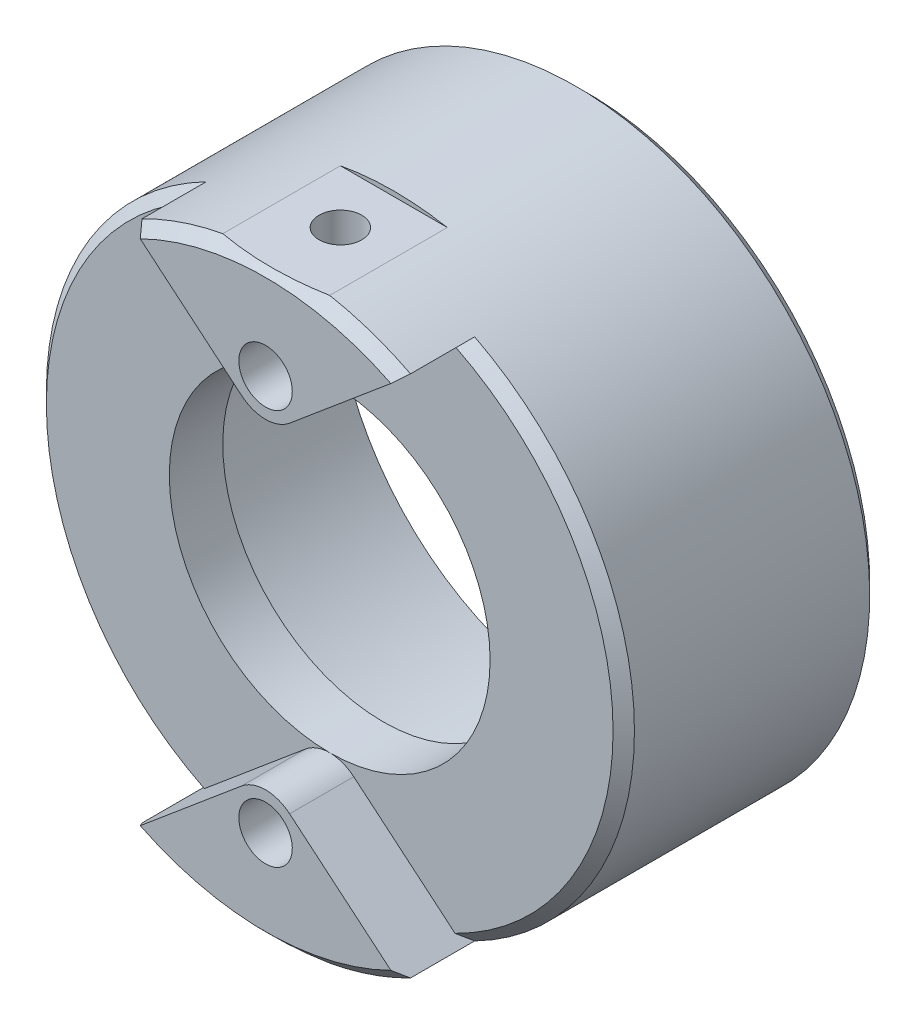
ISO-10303-21;
HEADER;
FILE_DESCRIPTION(('STEP AP214'),'2;1');
FILE_NAME('part.step','',(''),(''),'','','');
FILE_SCHEMA(('AUTOMOTIVE_DESIGN { 1 0 10303 214 1 1 1 1 }'));
ENDSEC;
DATA;
#1=APPLICATION_CONTEXT('core data for automotive mechanical design processes');
#2=APPLICATION_PROTOCOL_DEFINITION('international standard','automotive_design',2000,#1);
#3=PRODUCT_CONTEXT('',#1,'mechanical');
#4=PRODUCT('Part','Part','',(#3));
#5=PRODUCT_RELATED_PRODUCT_CATEGORY('part','',(#4));
#6=PRODUCT_DEFINITION_FORMATION('','',#4);
#7=PRODUCT_DEFINITION_CONTEXT('part definition',#1,'design');
#8=PRODUCT_DEFINITION('design','',#6,#7);
#9=PRODUCT_DEFINITION_SHAPE('','',#8);
#10=(LENGTH_UNIT() NAMED_UNIT(*) SI_UNIT(.MILLI.,.METRE.));
#11=(NAMED_UNIT(*) PLANE_ANGLE_UNIT() SI_UNIT($,.RADIAN.));
#12=(NAMED_UNIT(*) SI_UNIT($,.STERADIAN.) SOLID_ANGLE_UNIT());
#13=UNCERTAINTY_MEASURE_WITH_UNIT(LENGTH_MEASURE(1.E-05),#10,'distance_accuracy_value','');
#14=(GEOMETRIC_REPRESENTATION_CONTEXT(3) GLOBAL_UNCERTAINTY_ASSIGNED_CONTEXT((#13)) GLOBAL_UNIT_ASSIGNED_CONTEXT((#10,
#11,#12)) REPRESENTATION_CONTEXT('',''));
#15=CARTESIAN_POINT('',(0.,0.,0.));
#16=DIRECTION('',(0.,0.,1.));
#17=DIRECTION('',(1.,0.,0.));
#18=AXIS2_PLACEMENT_3D('',#15,#16,#17);
#19=CARTESIAN_POINT('',(0.,15.,19.));
#20=DIRECTION('',(0.,0.,1.));
#21=DIRECTION('',(0.,-1.,0.));
#22=AXIS2_PLACEMENT_3D('',#19,#20,#21);
#23=PLANE('',#22);
#24=CARTESIAN_POINT('',(0.,0.,19.));
#25=DIRECTION('',(0.,0.,1.));
#26=DIRECTION('',(0.,-1.,0.));
#27=AXIS2_PLACEMENT_3D('',#24,#25,#26);
#28=CIRCLE('',#27,15.);
#29=CARTESIAN_POINT('',(0.,-15.,19.));
#30=VERTEX_POINT('',#29);
#31=EDGE_CURVE('E302',#30,#30,#28,.T.);
#32=ORIENTED_EDGE('',*,*,#31,.T.);
#33=EDGE_LOOP('',(#32));
#34=FACE_BOUND('',#33,.T.);
#35=CARTESIAN_POINT('',(0.,0.,19.));
#36=DIRECTION('',(0.,0.,1.));
#37=DIRECTION('',(0.,-1.,0.));
#38=AXIS2_PLACEMENT_3D('',#35,#36,#37);
#39=CIRCLE('',#38,23.5);
#40=CARTESIAN_POINT('',(0.,-23.5,19.));
#41=VERTEX_POINT('',#40);
#42=EDGE_CURVE('E303',#41,#41,#39,.T.);
#43=ORIENTED_EDGE('',*,*,#42,.F.);
#44=EDGE_LOOP('',(#43));
#45=FACE_BOUND('',#44,.T.);
#46=CARTESIAN_POINT('',(0.,18.5,19.));
#47=DIRECTION('',(0.,0.,1.));
#48=DIRECTION('',(0.,-1.,0.));
#49=AXIS2_PLACEMENT_3D('',#46,#47,#48);
#50=CIRCLE('',#49,2.5);
#51=CARTESIAN_POINT('',(0.,16.,19.));
#52=VERTEX_POINT('',#51);
#53=EDGE_CURVE('E226',#52,#52,#50,.F.);
#54=ORIENTED_EDGE('',*,*,#53,.F.);
#55=EDGE_LOOP('',(#54));
#56=FACE_BOUND('',#55,.T.);
#57=CARTESIAN_POINT('',(0.,-18.5,19.));
#58=DIRECTION('',(0.,0.,1.));
#59=DIRECTION('',(0.,-1.,0.));
#60=AXIS2_PLACEMENT_3D('',#57,#58,#59);
#61=CIRCLE('',#60,2.5);
#62=CARTESIAN_POINT('',(0.,-21.,19.));
#63=VERTEX_POINT('',#62);
#64=EDGE_CURVE('E249',#63,#63,#61,.T.);
#65=ORIENTED_EDGE('',*,*,#64,.T.);
#66=EDGE_LOOP('',(#65));
#67=FACE_BOUND('',#66,.T.);
#68=ADVANCED_FACE('F78',(#34,#45,#56,#67),#23,.F.);
#69=CARTESIAN_POINT('',(0.,27.5,30.));
#70=DIRECTION('',(0.,0.,-1.));
#71=DIRECTION('',(0.,1.,0.));
#72=AXIS2_PLACEMENT_3D('',#69,#70,#71);
#73=PLANE('',#72);
#74=CARTESIAN_POINT('',(0.,18.5,30.));
#75=DIRECTION('',(0.,0.,1.));
#76=DIRECTION('',(0.,-1.,0.));
#77=AXIS2_PLACEMENT_3D('',#74,#75,#76);
#78=CIRCLE('',#77,2.5);
#79=CARTESIAN_POINT('',(0.,16.,30.));
#80=VERTEX_POINT('',#79);
#81=EDGE_CURVE('E212',#80,#80,#78,.F.);
#82=ORIENTED_EDGE('',*,*,#81,.T.);
#83=EDGE_LOOP('',(#82));
#84=FACE_BOUND('',#83,.T.);
#85=DIRECTION('',(0.766044443118979,0.642787609686538,0.));
#86=VECTOR('',#85,1.);
#87=CARTESIAN_POINT('',(-6.85971508146003,8.1750900925027,30.));
#88=LINE('',#87,#86);
#89=CARTESIAN_POINT('',(2.24975663390289,15.8188444490836,30.));
#90=VERTEX_POINT('',#89);
#91=CARTESIAN_POINT('',(11.7215959154198,23.7666612967748,30.));
#92=VERTEX_POINT('',#91);
#93=EDGE_CURVE('E232',#90,#92,#88,.T.);
#94=ORIENTED_EDGE('',*,*,#93,.T.);
#95=CARTESIAN_POINT('',(0.,0.,30.));
#96=DIRECTION('',(0.,0.,-1.));
#97=DIRECTION('',(0.,1.,0.));
#98=AXIS2_PLACEMENT_3D('',#95,#96,#97);
#99=CIRCLE('',#98,26.5);
#100=CARTESIAN_POINT('',(-11.7215959154198,23.7666612967748,30.));
#101=VERTEX_POINT('',#100);
#102=EDGE_CURVE('E439',#92,#101,#99,.F.);
#103=ORIENTED_EDGE('',*,*,#102,.T.);
#104=DIRECTION('',(-0.766044443118979,0.642787609686538,0.));
#105=VECTOR('',#104,1.);
#106=CARTESIAN_POINT('',(6.85971508146003,8.1750900925027,30.));
#107=LINE('',#106,#105);
#108=CARTESIAN_POINT('',(-2.24975663390289,15.8188444490836,30.));
#109=VERTEX_POINT('',#108);
#110=EDGE_CURVE('E285',#109,#101,#107,.T.);
#111=ORIENTED_EDGE('',*,*,#110,.F.);
#112=CARTESIAN_POINT('',(0.,18.5,30.));
#113=DIRECTION('',(0.,0.,1.));
#114=DIRECTION('',(0.,-1.,0.));
#115=AXIS2_PLACEMENT_3D('',#112,#113,#114);
#116=CIRCLE('',#115,3.5);
#117=EDGE_CURVE('E258',#109,#90,#116,.T.);
#118=ORIENTED_EDGE('',*,*,#117,.T.);
#119=EDGE_LOOP('',(#94,#103,#111,#118));
#120=FACE_BOUND('',#119,.T.);
#121=ADVANCED_FACE('F461',(#84,#120),#73,.F.);
#122=CARTESIAN_POINT('',(0.,0.,29.0382165605096));
#123=DIRECTION('',(0.,0.,1.));
#124=DIRECTION('',(0.,-1.,0.));
#125=AXIS2_PLACEMENT_3D('',#122,#123,#124);
#126=CYLINDRICAL_SURFACE('',#125,15.);
#127=ORIENTED_EDGE('',*,*,#31,.F.);
#128=EDGE_LOOP('',(#127));
#129=FACE_BOUND('',#128,.T.);
#130=CARTESIAN_POINT('',(0.,0.,24.));
#131=DIRECTION('',(0.,0.,1.));
#132=DIRECTION('',(0.,-1.,0.));
#133=AXIS2_PLACEMENT_3D('',#130,#131,#132);
#134=CIRCLE('',#133,15.);
#135=CARTESIAN_POINT('',(0.,15.,24.));
#136=VERTEX_POINT('',#135);
#137=CARTESIAN_POINT('',(0.,-15.,24.));
#138=VERTEX_POINT('',#137);
#139=EDGE_CURVE('E231',#136,#138,#134,.F.);
#140=ORIENTED_EDGE('',*,*,#139,.F.);
#141=CARTESIAN_POINT('',(0.,0.,24.));
#142=DIRECTION('',(0.,0.,1.));
#143=DIRECTION('',(0.,-1.,0.));
#144=AXIS2_PLACEMENT_3D('',#141,#142,#143);
#145=CIRCLE('',#144,15.);
#146=EDGE_CURVE('E279',#138,#136,#145,.F.);
#147=ORIENTED_EDGE('',*,*,#146,.F.);
#148=EDGE_LOOP('',(#140,#147));
#149=FACE_BOUND('',#148,.T.);
#150=ADVANCED_FACE('F469',(#129,#149),#126,.F.);
#151=CARTESIAN_POINT('',(0.,-18.5,30.));
#152=DIRECTION('',(0.,0.,1.));
#153=DIRECTION('',(0.,-1.,0.));
#154=AXIS2_PLACEMENT_3D('',#151,#152,#153);
#155=CIRCLE('',#154,2.5);
#156=CARTESIAN_POINT('',(0.,-21.,30.));
#157=VERTEX_POINT('',#156);
#158=EDGE_CURVE('E221',#157,#157,#155,.T.);
#159=ORIENTED_EDGE('',*,*,#158,.F.);
#160=EDGE_LOOP('',(#159));
#161=FACE_BOUND('',#160,.T.);
#162=DIRECTION('',(-0.766044443118979,-0.642787609686538,0.));
#163=VECTOR('',#162,1.);
#164=CARTESIAN_POINT('',(6.85971508146003,-8.17509009250271,30.));
#165=LINE('',#164,#163);
#166=CARTESIAN_POINT('',(-2.24975663390289,-15.8188444490836,30.));
#167=VERTEX_POINT('',#166);
#168=CARTESIAN_POINT('',(-11.7215959154198,-23.7666612967748,30.));
#169=VERTEX_POINT('',#168);
#170=EDGE_CURVE('E288',#167,#169,#165,.T.);
#171=ORIENTED_EDGE('',*,*,#170,.T.);
#172=CARTESIAN_POINT('',(0.,0.,30.));
#173=DIRECTION('',(0.,0.,-1.));
#174=DIRECTION('',(0.,1.,0.));
#175=AXIS2_PLACEMENT_3D('',#172,#173,#174);
#176=CIRCLE('',#175,26.5);
#177=CARTESIAN_POINT('',(11.7215959154198,-23.7666612967748,30.));
#178=VERTEX_POINT('',#177);
#179=EDGE_CURVE('E335',#169,#178,#176,.F.);
#180=ORIENTED_EDGE('',*,*,#179,.T.);
#181=DIRECTION('',(0.766044443118979,-0.642787609686538,0.));
#182=VECTOR('',#181,1.);
#183=CARTESIAN_POINT('',(-6.85971508146003,-8.17509009250271,30.));
#184=LINE('',#183,#182);
#185=CARTESIAN_POINT('',(2.24975663390289,-15.8188444490836,30.));
#186=VERTEX_POINT('',#185);
#187=EDGE_CURVE('E250',#186,#178,#184,.T.);
#188=ORIENTED_EDGE('',*,*,#187,.F.);
#189=CARTESIAN_POINT('',(0.,-18.5,30.));
#190=DIRECTION('',(0.,0.,1.));
#191=DIRECTION('',(0.,-1.,0.));
#192=AXIS2_PLACEMENT_3D('',#189,#190,#191);
#193=CIRCLE('',#192,3.5);
#194=EDGE_CURVE('E267',#167,#186,#193,.F.);
#195=ORIENTED_EDGE('',*,*,#194,.F.);
#196=EDGE_LOOP('',(#171,#180,#188,#195));
#197=FACE_BOUND('',#196,.T.);
#198=ADVANCED_FACE('F471',(#161,#197),#73,.F.);
#199=CARTESIAN_POINT('',(0.,23.5,0.));
#200=DIRECTION('',(0.,0.,1.));
#201=DIRECTION('',(0.,-1.,0.));
#202=AXIS2_PLACEMENT_3D('',#199,#200,#201);
#203=PLANE('',#202);
#204=CARTESIAN_POINT('',(0.,0.,0.));
#205=DIRECTION('',(0.,0.,1.));
#206=DIRECTION('',(0.,-1.,0.));
#207=AXIS2_PLACEMENT_3D('',#204,#205,#206);
#208=CIRCLE('',#207,26.5);
#209=CARTESIAN_POINT('',(0.,-26.5,0.));
#210=VERTEX_POINT('',#209);
#211=EDGE_CURVE('E500',#210,#210,#208,.F.);
#212=ORIENTED_EDGE('',*,*,#211,.T.);
#213=EDGE_LOOP('',(#212));
#214=FACE_BOUND('',#213,.T.);
#215=CARTESIAN_POINT('',(0.,0.,0.));
#216=DIRECTION('',(0.,0.,1.));
#217=DIRECTION('',(0.,-1.,0.));
#218=AXIS2_PLACEMENT_3D('',#215,#216,#217);
#219=CIRCLE('',#218,23.5);
#220=CARTESIAN_POINT('',(0.,-23.5,0.));
#221=VERTEX_POINT('',#220);
#222=EDGE_CURVE('E295',#221,#221,#219,.T.);
#223=ORIENTED_EDGE('',*,*,#222,.T.);
#224=EDGE_LOOP('',(#223));
#225=FACE_BOUND('',#224,.T.);
#226=ADVANCED_FACE('F409',(#214,#225),#203,.F.);
#227=CARTESIAN_POINT('',(0.,0.,29.0382165605096));
#228=DIRECTION('',(0.,0.,1.));
#229=DIRECTION('',(0.,-1.,0.));
#230=AXIS2_PLACEMENT_3D('',#227,#228,#229);
#231=CYLINDRICAL_SURFACE('',#230,27.5);
#232=CARTESIAN_POINT('',(0.,0.,1.00000000000001));
#233=DIRECTION('',(0.,0.,1.));
#234=DIRECTION('',(0.,-1.,0.));
#235=AXIS2_PLACEMENT_3D('',#232,#233,#234);
#236=CIRCLE('',#235,27.5);
#237=CARTESIAN_POINT('',(0.,-27.5,1.00000000000001));
#238=VERTEX_POINT('',#237);
#239=EDGE_CURVE('E314',#238,#238,#236,.T.);
#240=ORIENTED_EDGE('',*,*,#239,.T.);
#241=EDGE_LOOP('',(#240));
#242=FACE_BOUND('',#241,.T.);
#243=CARTESIAN_POINT('',(0.,0.,18.));
#244=DIRECTION('',(0.,0.,-1.));
#245=DIRECTION('',(-1.,0.,0.));
#246=AXIS2_PLACEMENT_3D('',#243,#244,#245);
#247=CIRCLE('',#246,27.5);
#248=CARTESIAN_POINT('',(-5.,27.0416345659799,18.));
#249=VERTEX_POINT('',#248);
#250=CARTESIAN_POINT('',(5.,27.0416345659799,18.));
#251=VERTEX_POINT('',#250);
#252=EDGE_CURVE('E12',#249,#251,#247,.T.);
#253=ORIENTED_EDGE('',*,*,#252,.T.);
#254=DIRECTION('',(0.,0.,1.));
#255=VECTOR('',#254,1.);
#256=CARTESIAN_POINT('',(5.,27.0416345659799,18.));
#257=LINE('',#256,#255);
#258=CARTESIAN_POINT('',(5.,27.0416345659799,29.));
#259=VERTEX_POINT('',#258);
#260=EDGE_CURVE('E202',#251,#259,#257,.T.);
#261=ORIENTED_EDGE('',*,*,#260,.T.);
#262=CARTESIAN_POINT('',(0.,0.,29.));
#263=DIRECTION('',(0.,0.,-1.));
#264=DIRECTION('',(0.,1.,0.));
#265=AXIS2_PLACEMENT_3D('',#262,#263,#264);
#266=CIRCLE('',#265,27.5);
#267=CARTESIAN_POINT('',(12.5555783533499,24.4664556528503,29.));
#268=VERTEX_POINT('',#267);
#269=EDGE_CURVE('E320',#259,#268,#266,.T.);
#270=ORIENTED_EDGE('',*,*,#269,.T.);
#271=DIRECTION('',(0.,0.,1.));
#272=VECTOR('',#271,1.);
#273=CARTESIAN_POINT('',(12.5555783533499,24.4664556528503,24.));
#274=LINE('',#273,#272);
#275=CARTESIAN_POINT('',(12.5555783533499,24.4664556528503,23.));
#276=VERTEX_POINT('',#275);
#277=EDGE_CURVE('E260',#276,#268,#274,.T.);
#278=ORIENTED_EDGE('',*,*,#277,.F.);
#279=CARTESIAN_POINT('',(0.,0.,23.));
#280=DIRECTION('',(0.,0.,1.));
#281=DIRECTION('',(0.,-1.,0.));
#282=AXIS2_PLACEMENT_3D('',#279,#280,#281);
#283=CIRCLE('',#282,27.5);
#284=CARTESIAN_POINT('',(12.5555783533499,-24.4664556528503,23.));
#285=VERTEX_POINT('',#284);
#286=EDGE_CURVE('E323',#276,#285,#283,.F.);
#287=ORIENTED_EDGE('',*,*,#286,.T.);
#288=DIRECTION('',(0.,0.,1.));
#289=VECTOR('',#288,1.);
#290=CARTESIAN_POINT('',(12.5555783533499,-24.4664556528503,24.));
#291=LINE('',#290,#289);
#292=CARTESIAN_POINT('',(12.5555783533499,-24.4664556528503,29.));
#293=VERTEX_POINT('',#292);
#294=EDGE_CURVE('E257',#285,#293,#291,.T.);
#295=ORIENTED_EDGE('',*,*,#294,.T.);
#296=CARTESIAN_POINT('',(0.,0.,29.));
#297=DIRECTION('',(0.,0.,-1.));
#298=DIRECTION('',(0.,1.,0.));
#299=AXIS2_PLACEMENT_3D('',#296,#297,#298);
#300=CIRCLE('',#299,27.5);
#301=CARTESIAN_POINT('',(5.,-27.0416345659799,29.));
#302=VERTEX_POINT('',#301);
#303=EDGE_CURVE('E319',#293,#302,#300,.T.);
#304=ORIENTED_EDGE('',*,*,#303,.T.);
#305=DIRECTION('',(0.,0.,1.));
#306=VECTOR('',#305,1.);
#307=CARTESIAN_POINT('',(5.,-27.0416345659799,18.));
#308=LINE('',#307,#306);
#309=CARTESIAN_POINT('',(5.,-27.0416345659799,18.));
#310=VERTEX_POINT('',#309);
#311=EDGE_CURVE('E92',#310,#302,#308,.T.);
#312=ORIENTED_EDGE('',*,*,#311,.F.);
#313=CARTESIAN_POINT('',(0.,0.,18.));
#314=DIRECTION('',(0.,0.,-1.));
#315=DIRECTION('',(-1.,0.,0.));
#316=AXIS2_PLACEMENT_3D('',#313,#314,#315);
#317=CIRCLE('',#316,27.5);
#318=CARTESIAN_POINT('',(-5.,-27.0416345659799,18.));
#319=VERTEX_POINT('',#318);
#320=EDGE_CURVE('E86',#310,#319,#317,.T.);
#321=ORIENTED_EDGE('',*,*,#320,.T.);
#322=DIRECTION('',(0.,0.,1.));
#323=VECTOR('',#322,1.);
#324=CARTESIAN_POINT('',(-5.,-27.0416345659799,18.));
#325=LINE('',#324,#323);
#326=CARTESIAN_POINT('',(-5.,-27.0416345659799,29.));
#327=VERTEX_POINT('',#326);
#328=EDGE_CURVE('E217',#319,#327,#325,.T.);
#329=ORIENTED_EDGE('',*,*,#328,.T.);
#330=CARTESIAN_POINT('',(-12.5555783533499,-24.4664556528503,29.));
#331=VERTEX_POINT('',#330);
#332=EDGE_CURVE('E317',#327,#331,#300,.T.);
#333=ORIENTED_EDGE('',*,*,#332,.T.);
#334=DIRECTION('',(0.,0.,1.));
#335=VECTOR('',#334,1.);
#336=CARTESIAN_POINT('',(-12.5555783533499,-24.4664556528503,24.));
#337=LINE('',#336,#335);
#338=CARTESIAN_POINT('',(-12.5555783533499,-24.4664556528503,23.));
#339=VERTEX_POINT('',#338);
#340=EDGE_CURVE('E291',#339,#331,#337,.T.);
#341=ORIENTED_EDGE('',*,*,#340,.F.);
#342=CARTESIAN_POINT('',(0.,0.,23.));
#343=DIRECTION('',(0.,0.,1.));
#344=DIRECTION('',(0.,-1.,0.));
#345=AXIS2_PLACEMENT_3D('',#342,#343,#344);
#346=CIRCLE('',#345,27.5);
#347=CARTESIAN_POINT('',(-12.5555783533499,24.4664556528503,23.));
#348=VERTEX_POINT('',#347);
#349=EDGE_CURVE('E326',#339,#348,#346,.F.);
#350=ORIENTED_EDGE('',*,*,#349,.T.);
#351=DIRECTION('',(0.,0.,1.));
#352=VECTOR('',#351,1.);
#353=CARTESIAN_POINT('',(-12.5555783533499,24.4664556528503,24.));
#354=LINE('',#353,#352);
#355=CARTESIAN_POINT('',(-12.5555783533499,24.4664556528503,29.));
#356=VERTEX_POINT('',#355);
#357=EDGE_CURVE('E299',#348,#356,#354,.T.);
#358=ORIENTED_EDGE('',*,*,#357,.T.);
#359=CARTESIAN_POINT('',(-5.,27.0416345659799,29.));
#360=VERTEX_POINT('',#359);
#361=EDGE_CURVE('E215',#356,#360,#266,.T.);
#362=ORIENTED_EDGE('',*,*,#361,.T.);
#363=DIRECTION('',(0.,0.,1.));
#364=VECTOR('',#363,1.);
#365=CARTESIAN_POINT('',(-5.,27.0416345659799,18.));
#366=LINE('',#365,#364);
#367=EDGE_CURVE('E103',#249,#360,#366,.T.);
#368=ORIENTED_EDGE('',*,*,#367,.F.);
#369=EDGE_LOOP('',(#253,#261,#270,#278,#287,#295,#304,#312,#321,#329,#333,#341,#350,#358,#362,#368));
#370=FACE_BOUND('',#369,.T.);
#371=ADVANCED_FACE('F207',(#242,#370),#231,.T.);
#372=CARTESIAN_POINT('',(0.,0.,29.0382165605096));
#373=DIRECTION('',(0.,0.,1.));
#374=DIRECTION('',(0.,-1.,0.));
#375=AXIS2_PLACEMENT_3D('',#372,#373,#374);
#376=CYLINDRICAL_SURFACE('',#375,23.5);
#377=ORIENTED_EDGE('',*,*,#222,.F.);
#378=EDGE_LOOP('',(#377));
#379=FACE_BOUND('',#378,.T.);
#380=ORIENTED_EDGE('',*,*,#42,.T.);
#381=EDGE_LOOP('',(#380));
#382=FACE_BOUND('',#381,.T.);
#383=ADVANCED_FACE('F478',(#379,#382),#376,.F.);
#384=CARTESIAN_POINT('',(0.,18.5,24.));
#385=DIRECTION('',(0.,0.,1.));
#386=DIRECTION('',(0.,-1.,0.));
#387=AXIS2_PLACEMENT_3D('',#384,#385,#386);
#388=CYLINDRICAL_SURFACE('',#387,3.5);
#389=ORIENTED_EDGE('',*,*,#117,.F.);
#390=DIRECTION('',(0.,0.,1.));
#391=VECTOR('',#390,1.);
#392=CARTESIAN_POINT('',(-2.24975663390289,15.8188444490836,24.));
#393=LINE('',#392,#391);
#394=CARTESIAN_POINT('',(-2.24975663390289,15.8188444490836,24.));
#395=VERTEX_POINT('',#394);
#396=EDGE_CURVE('E284',#395,#109,#393,.T.);
#397=ORIENTED_EDGE('',*,*,#396,.F.);
#398=CARTESIAN_POINT('',(0.,18.5,24.));
#399=DIRECTION('',(0.,0.,1.));
#400=DIRECTION('',(0.,-1.,0.));
#401=AXIS2_PLACEMENT_3D('',#398,#399,#400);
#402=CIRCLE('',#401,3.5);
#403=EDGE_CURVE('E264',#395,#136,#402,.T.);
#404=ORIENTED_EDGE('',*,*,#403,.T.);
#405=CARTESIAN_POINT('',(0.,18.5,24.));
#406=DIRECTION('',(0.,0.,1.));
#407=DIRECTION('',(0.,-1.,0.));
#408=AXIS2_PLACEMENT_3D('',#405,#406,#407);
#409=CIRCLE('',#408,3.5);
#410=CARTESIAN_POINT('',(2.24975663390289,15.8188444490836,24.));
#411=VERTEX_POINT('',#410);
#412=EDGE_CURVE('E227',#136,#411,#409,.T.);
#413=ORIENTED_EDGE('',*,*,#412,.T.);
#414=DIRECTION('',(0.,0.,1.));
#415=VECTOR('',#414,1.);
#416=CARTESIAN_POINT('',(2.24975663390289,15.8188444490836,24.));
#417=LINE('',#416,#415);
#418=EDGE_CURVE('E251',#411,#90,#417,.T.);
#419=ORIENTED_EDGE('',*,*,#418,.T.);
#420=EDGE_LOOP('',(#389,#397,#404,#413,#419));
#421=FACE_BOUND('',#420,.T.);
#422=ADVANCED_FACE('F427',(#421),#388,.T.);
#423=CARTESIAN_POINT('',(0.,-18.5,24.));
#424=DIRECTION('',(0.,0.,1.));
#425=DIRECTION('',(0.,-1.,0.));
#426=AXIS2_PLACEMENT_3D('',#423,#424,#425);
#427=CYLINDRICAL_SURFACE('',#426,3.5);
#428=ORIENTED_EDGE('',*,*,#194,.T.);
#429=DIRECTION('',(0.,0.,1.));
#430=VECTOR('',#429,1.);
#431=CARTESIAN_POINT('',(2.24975663390289,-15.8188444490836,24.));
#432=LINE('',#431,#430);
#433=CARTESIAN_POINT('',(2.24975663390289,-15.8188444490836,24.));
#434=VERTEX_POINT('',#433);
#435=EDGE_CURVE('E248',#434,#186,#432,.T.);
#436=ORIENTED_EDGE('',*,*,#435,.F.);
#437=CARTESIAN_POINT('',(0.,-18.5,24.));
#438=DIRECTION('',(0.,0.,1.));
#439=DIRECTION('',(0.,-1.,0.));
#440=AXIS2_PLACEMENT_3D('',#437,#438,#439);
#441=CIRCLE('',#440,3.5);
#442=EDGE_CURVE('E240',#138,#434,#441,.F.);
#443=ORIENTED_EDGE('',*,*,#442,.F.);
#444=CARTESIAN_POINT('',(0.,-18.5,24.));
#445=DIRECTION('',(0.,0.,1.));
#446=DIRECTION('',(0.,-1.,0.));
#447=AXIS2_PLACEMENT_3D('',#444,#445,#446);
#448=CIRCLE('',#447,3.5);
#449=CARTESIAN_POINT('',(-2.24975663390289,-15.8188444490836,24.));
#450=VERTEX_POINT('',#449);
#451=EDGE_CURVE('E274',#450,#138,#448,.F.);
#452=ORIENTED_EDGE('',*,*,#451,.F.);
#453=DIRECTION('',(0.,0.,1.));
#454=VECTOR('',#453,1.);
#455=CARTESIAN_POINT('',(-2.24975663390289,-15.8188444490836,24.));
#456=LINE('',#455,#454);
#457=EDGE_CURVE('E289',#450,#167,#456,.T.);
#458=ORIENTED_EDGE('',*,*,#457,.T.);
#459=EDGE_LOOP('',(#428,#436,#443,#452,#458));
#460=FACE_BOUND('',#459,.T.);
#461=ADVANCED_FACE('F541',(#460),#427,.T.);
#462=CARTESIAN_POINT('',(6.85971508146003,-8.17509009250271,24.));
#463=DIRECTION('',(-0.642787609686538,0.766044443118979,0.));
#464=DIRECTION('',(-0.766044443118979,-0.642787609686538,0.));
#465=AXIS2_PLACEMENT_3D('',#462,#463,#464);
#466=PLANE('',#465);
#467=ORIENTED_EDGE('',*,*,#340,.T.);
#468=CARTESIAN_POINT('',(-12.5555783533499,-24.4664556528503,29.));
#469=CARTESIAN_POINT('',(-12.4167994776617,-24.3500063494452,29.1669767592989));
#470=CARTESIAN_POINT('',(-12.2779115042647,-24.2334655021928,29.3337984711569));
#471=CARTESIAN_POINT('',(-11.9999173582939,-24.0002007168393,29.6671318044986));
#472=CARTESIAN_POINT('',(-11.8608111857142,-23.8834767787332,29.8336434259739));
#473=CARTESIAN_POINT('',(-11.7215959154198,-23.7666612967748,30.));
#474=B_SPLINE_CURVE_WITH_KNOTS('',3,(#468,#469,#470,#471,#472,#473),.UNSPECIFIED.,.F.,.F.,(4,2,
4),(0.,0.739127929399816,1.47825587878882),.UNSPECIFIED.);
#475=EDGE_CURVE('E341',#331,#169,#474,.T.);
#476=ORIENTED_EDGE('',*,*,#475,.T.);
#477=ORIENTED_EDGE('',*,*,#170,.F.);
#478=ORIENTED_EDGE('',*,*,#457,.F.);
#479=DIRECTION('',(-0.766044443118979,-0.642787609686538,0.));
#480=VECTOR('',#479,1.);
#481=CARTESIAN_POINT('',(6.85971508146003,-8.17509009250271,24.));
#482=LINE('',#481,#480);
#483=CARTESIAN_POINT('',(-11.7215959154198,-23.7666612967748,24.));
#484=VERTEX_POINT('',#483);
#485=EDGE_CURVE('E275',#450,#484,#482,.T.);
#486=ORIENTED_EDGE('',*,*,#485,.T.);
#487=CARTESIAN_POINT('',(-11.7215959154198,-23.7666612967748,24.));
#488=CARTESIAN_POINT('',(-11.8608111857142,-23.8834767787332,23.8336434259739));
#489=CARTESIAN_POINT('',(-11.9999173582939,-24.0002007168393,23.6671318044986));
#490=CARTESIAN_POINT('',(-12.2779115042647,-24.2334655021928,23.3337984711569));
#491=CARTESIAN_POINT('',(-12.4167994776617,-24.3500063494452,23.1669767592989));
#492=CARTESIAN_POINT('',(-12.5555783533499,-24.4664556528503,23.));
#493=B_SPLINE_CURVE_WITH_KNOTS('',3,(#487,#488,#489,#490,#491,#492),.UNSPECIFIED.,.F.,.F.,(4,2,
4),(0.,0.739127949389008,1.47825587878883),.UNSPECIFIED.);
#494=EDGE_CURVE('E407',#484,#339,#493,.T.);
#495=ORIENTED_EDGE('',*,*,#494,.T.);
#496=EDGE_LOOP('',(#467,#476,#477,#478,#486,#495));
#497=FACE_BOUND('',#496,.T.);
#498=ADVANCED_FACE('F426',(#497),#466,.T.);
#499=CARTESIAN_POINT('',(6.85971508146003,8.1750900925027,24.));
#500=DIRECTION('',(0.642787609686538,0.766044443118979,0.));
#501=DIRECTION('',(-0.766044443118979,0.642787609686538,0.));
#502=AXIS2_PLACEMENT_3D('',#499,#500,#501);
#503=PLANE('',#502);
#504=ORIENTED_EDGE('',*,*,#110,.T.);
#505=CARTESIAN_POINT('',(-11.7215959154198,23.7666612967748,30.));
#506=CARTESIAN_POINT('',(-11.8608111857142,23.8834767787332,29.8336434259739));
#507=CARTESIAN_POINT('',(-11.9999173582939,24.0002007168393,29.6671318044986));
#508=CARTESIAN_POINT('',(-12.2779115042647,24.2334655021928,29.3337984711569));
#509=CARTESIAN_POINT('',(-12.4167994776617,24.3500063494452,29.1669767592989));
#510=CARTESIAN_POINT('',(-12.5555783533499,24.4664556528503,29.));
#511=B_SPLINE_CURVE_WITH_KNOTS('',3,(#505,#506,#507,#508,#509,#510),.UNSPECIFIED.,.F.,.F.,(4,2,
4),(0.,0.739127949388997,1.4782558787888),.UNSPECIFIED.);
#512=EDGE_CURVE('E433',#101,#356,#511,.T.);
#513=ORIENTED_EDGE('',*,*,#512,.T.);
#514=ORIENTED_EDGE('',*,*,#357,.F.);
#515=CARTESIAN_POINT('',(-12.5555783533499,24.4664556528503,23.));
#516=CARTESIAN_POINT('',(-12.4167994776617,24.3500063494452,23.1669767592989));
#517=CARTESIAN_POINT('',(-12.2779115042647,24.2334655021928,23.3337984711569));
#518=CARTESIAN_POINT('',(-11.9999173582939,24.0002007168393,23.6671318044986));
#519=CARTESIAN_POINT('',(-11.8608111857142,23.8834767787332,23.8336434259739));
#520=CARTESIAN_POINT('',(-11.7215959154198,23.7666612967748,24.));
#521=B_SPLINE_CURVE_WITH_KNOTS('',3,(#515,#516,#517,#518,#519,#520),.UNSPECIFIED.,.F.,.F.,(4,2,
4),(0.,0.73912792939982,1.47825587878883),.UNSPECIFIED.);
#522=CARTESIAN_POINT('',(-11.7215959154198,23.7666612967748,24.));
#523=VERTEX_POINT('',#522);
#524=EDGE_CURVE('E418',#348,#523,#521,.T.);
#525=ORIENTED_EDGE('',*,*,#524,.T.);
#526=DIRECTION('',(-0.766044443118979,0.642787609686538,0.));
#527=VECTOR('',#526,1.);
#528=CARTESIAN_POINT('',(6.85971508146003,8.1750900925027,24.));
#529=LINE('',#528,#527);
#530=EDGE_CURVE('E268',#395,#523,#529,.T.);
#531=ORIENTED_EDGE('',*,*,#530,.F.);
#532=ORIENTED_EDGE('',*,*,#396,.T.);
#533=EDGE_LOOP('',(#504,#513,#514,#525,#531,#532));
#534=FACE_BOUND('',#533,.T.);
#535=ADVANCED_FACE('F425',(#534),#503,.F.);
#536=CARTESIAN_POINT('',(0.,0.,24.));
#537=DIRECTION('',(0.,0.,1.));
#538=DIRECTION('',(0.,-1.,0.));
#539=AXIS2_PLACEMENT_3D('',#536,#537,#538);
#540=PLANE('',#539);
#541=ORIENTED_EDGE('',*,*,#530,.T.);
#542=CARTESIAN_POINT('',(0.,0.,24.));
#543=DIRECTION('',(0.,0.,1.));
#544=DIRECTION('',(0.,-1.,0.));
#545=AXIS2_PLACEMENT_3D('',#542,#543,#544);
#546=CIRCLE('',#545,26.5);
#547=EDGE_CURVE('E307',#523,#484,#546,.T.);
#548=ORIENTED_EDGE('',*,*,#547,.T.);
#549=ORIENTED_EDGE('',*,*,#485,.F.);
#550=ORIENTED_EDGE('',*,*,#451,.T.);
#551=ORIENTED_EDGE('',*,*,#146,.T.);
#552=ORIENTED_EDGE('',*,*,#403,.F.);
#553=EDGE_LOOP('',(#541,#548,#549,#550,#551,#552));
#554=FACE_BOUND('',#553,.T.);
#555=ADVANCED_FACE('F365',(#554),#540,.T.);
#556=CARTESIAN_POINT('',(-6.85971508146003,8.1750900925027,24.));
#557=DIRECTION('',(0.642787609686538,-0.766044443118979,0.));
#558=DIRECTION('',(0.766044443118979,0.642787609686538,0.));
#559=AXIS2_PLACEMENT_3D('',#556,#557,#558);
#560=PLANE('',#559);
#561=ORIENTED_EDGE('',*,*,#277,.T.);
#562=CARTESIAN_POINT('',(12.5555783533499,24.4664556528503,29.));
#563=CARTESIAN_POINT('',(12.4167994776617,24.3500063494452,29.1669767592989));
#564=CARTESIAN_POINT('',(12.2779115042647,24.2334655021928,29.3337984711569));
#565=CARTESIAN_POINT('',(11.9999173582939,24.0002007168393,29.6671318044986));
#566=CARTESIAN_POINT('',(11.8608111857142,23.8834767787332,29.8336434259739));
#567=CARTESIAN_POINT('',(11.7215959154198,23.7666612967748,30.));
#568=B_SPLINE_CURVE_WITH_KNOTS('',3,(#562,#563,#564,#565,#566,#567),.UNSPECIFIED.,.F.,.F.,(4,2,
4),(0.,0.739127929399808,1.4782558787888),.UNSPECIFIED.);
#569=EDGE_CURVE('E438',#268,#92,#568,.T.);
#570=ORIENTED_EDGE('',*,*,#569,.T.);
#571=ORIENTED_EDGE('',*,*,#93,.F.);
#572=ORIENTED_EDGE('',*,*,#418,.F.);
#573=DIRECTION('',(0.766044443118979,0.642787609686538,0.));
#574=VECTOR('',#573,1.);
#575=CARTESIAN_POINT('',(-6.85971508146003,8.1750900925027,24.));
#576=LINE('',#575,#574);
#577=CARTESIAN_POINT('',(11.7215959154198,23.7666612967748,24.));
#578=VERTEX_POINT('',#577);
#579=EDGE_CURVE('E245',#411,#578,#576,.T.);
#580=ORIENTED_EDGE('',*,*,#579,.T.);
#581=CARTESIAN_POINT('',(11.7215959154198,23.7666612967748,24.));
#582=CARTESIAN_POINT('',(11.8608111857142,23.8834767787332,23.8336434259739));
#583=CARTESIAN_POINT('',(11.9999173582939,24.0002007168393,23.6671318044986));
#584=CARTESIAN_POINT('',(12.2779115042647,24.2334655021928,23.3337984711569));
#585=CARTESIAN_POINT('',(12.4167994776617,24.3500063494452,23.1669767592989));
#586=CARTESIAN_POINT('',(12.5555783533499,24.4664556528503,23.));
#587=B_SPLINE_CURVE_WITH_KNOTS('',3,(#581,#582,#583,#584,#585,#586),.UNSPECIFIED.,.F.,.F.,(4,2,
4),(0.,0.739127949389008,1.47825587878883),.UNSPECIFIED.);
#588=EDGE_CURVE('E376',#578,#276,#587,.T.);
#589=ORIENTED_EDGE('',*,*,#588,.T.);
#590=EDGE_LOOP('',(#561,#570,#571,#572,#580,#589));
#591=FACE_BOUND('',#590,.T.);
#592=ADVANCED_FACE('F359',(#591),#560,.T.);
#593=CARTESIAN_POINT('',(-6.85971508146003,-8.17509009250271,24.));
#594=DIRECTION('',(-0.642787609686538,-0.766044443118979,0.));
#595=DIRECTION('',(0.766044443118979,-0.642787609686538,0.));
#596=AXIS2_PLACEMENT_3D('',#593,#594,#595);
#597=PLANE('',#596);
#598=ORIENTED_EDGE('',*,*,#187,.T.);
#599=CARTESIAN_POINT('',(11.7215959154198,-23.7666612967748,30.));
#600=CARTESIAN_POINT('',(11.8608111857142,-23.8834767787332,29.8336434259739));
#601=CARTESIAN_POINT('',(11.9999173582939,-24.0002007168393,29.6671318044986));
#602=CARTESIAN_POINT('',(12.2779115042647,-24.2334655021928,29.3337984711569));
#603=CARTESIAN_POINT('',(12.4167994776617,-24.3500063494452,29.1669767592989));
#604=CARTESIAN_POINT('',(12.5555783533499,-24.4664556528503,29.));
#605=B_SPLINE_CURVE_WITH_KNOTS('',3,(#599,#600,#601,#602,#603,#604),.UNSPECIFIED.,.F.,.F.,(4,2,
4),(0.,0.739127949389006,1.47825587878882),.UNSPECIFIED.);
#606=EDGE_CURVE('E333',#178,#293,#605,.T.);
#607=ORIENTED_EDGE('',*,*,#606,.T.);
#608=ORIENTED_EDGE('',*,*,#294,.F.);
#609=CARTESIAN_POINT('',(12.5555783533499,-24.4664556528503,23.));
#610=CARTESIAN_POINT('',(12.4167994776617,-24.3500063494452,23.1669767592989));
#611=CARTESIAN_POINT('',(12.2779115042647,-24.2334655021928,23.3337984711569));
#612=CARTESIAN_POINT('',(11.9999173582939,-24.0002007168393,23.6671318044986));
#613=CARTESIAN_POINT('',(11.8608111857142,-23.8834767787332,23.8336434259739));
#614=CARTESIAN_POINT('',(11.7215959154198,-23.7666612967748,24.));
#615=B_SPLINE_CURVE_WITH_KNOTS('',3,(#609,#610,#611,#612,#613,#614),.UNSPECIFIED.,.F.,.F.,(4,2,
4),(0.,0.739127929399819,1.47825587878883),.UNSPECIFIED.);
#616=CARTESIAN_POINT('',(11.7215959154198,-23.7666612967748,24.));
#617=VERTEX_POINT('',#616);
#618=EDGE_CURVE('E366',#285,#617,#615,.T.);
#619=ORIENTED_EDGE('',*,*,#618,.T.);
#620=DIRECTION('',(0.766044443118979,-0.642787609686538,0.));
#621=VECTOR('',#620,1.);
#622=CARTESIAN_POINT('',(-6.85971508146003,-8.17509009250271,24.));
#623=LINE('',#622,#621);
#624=EDGE_CURVE('E238',#434,#617,#623,.T.);
#625=ORIENTED_EDGE('',*,*,#624,.F.);
#626=ORIENTED_EDGE('',*,*,#435,.T.);
#627=EDGE_LOOP('',(#598,#607,#608,#619,#625,#626));
#628=FACE_BOUND('',#627,.T.);
#629=ADVANCED_FACE('F353',(#628),#597,.F.);
#630=CARTESIAN_POINT('',(0.,0.,24.));
#631=DIRECTION('',(0.,0.,1.));
#632=DIRECTION('',(0.,-1.,0.));
#633=AXIS2_PLACEMENT_3D('',#630,#631,#632);
#634=PLANE('',#633);
#635=ORIENTED_EDGE('',*,*,#624,.T.);
#636=CARTESIAN_POINT('',(0.,0.,24.));
#637=DIRECTION('',(0.,0.,1.));
#638=DIRECTION('',(0.,-1.,0.));
#639=AXIS2_PLACEMENT_3D('',#636,#637,#638);
#640=CIRCLE('',#639,26.5);
#641=EDGE_CURVE('E328',#617,#578,#640,.T.);
#642=ORIENTED_EDGE('',*,*,#641,.T.);
#643=ORIENTED_EDGE('',*,*,#579,.F.);
#644=ORIENTED_EDGE('',*,*,#412,.F.);
#645=ORIENTED_EDGE('',*,*,#139,.T.);
#646=ORIENTED_EDGE('',*,*,#442,.T.);
#647=EDGE_LOOP('',(#635,#642,#643,#644,#645,#646));
#648=FACE_BOUND('',#647,.T.);
#649=ADVANCED_FACE('F357',(#648),#634,.T.);
#650=CARTESIAN_POINT('',(0.,18.5,0.));
#651=DIRECTION('',(0.,0.,1.));
#652=DIRECTION('',(0.,-1.,0.));
#653=AXIS2_PLACEMENT_3D('',#650,#651,#652);
#654=CYLINDRICAL_SURFACE('',#653,2.5);
#655=ORIENTED_EDGE('',*,*,#81,.F.);
#656=EDGE_LOOP('',(#655));
#657=FACE_BOUND('',#656,.T.);
#658=ORIENTED_EDGE('',*,*,#53,.T.);
#659=EDGE_LOOP('',(#658));
#660=FACE_BOUND('',#659,.T.);
#661=ADVANCED_FACE('F510',(#657,#660),#654,.F.);
#662=CARTESIAN_POINT('',(0.,-18.5,0.));
#663=DIRECTION('',(0.,0.,1.));
#664=DIRECTION('',(0.,-1.,0.));
#665=AXIS2_PLACEMENT_3D('',#662,#663,#664);
#666=CYLINDRICAL_SURFACE('',#665,2.5);
#667=ORIENTED_EDGE('',*,*,#158,.T.);
#668=EDGE_LOOP('',(#667));
#669=FACE_BOUND('',#668,.T.);
#670=ORIENTED_EDGE('',*,*,#64,.F.);
#671=EDGE_LOOP('',(#670));
#672=FACE_BOUND('',#671,.T.);
#673=ADVANCED_FACE('F404',(#669,#672),#666,.F.);
#674=CARTESIAN_POINT('',(0.,0.,24.));
#675=DIRECTION('',(0.,0.,-1.));
#676=DIRECTION('',(0.,1.,0.));
#677=AXIS2_PLACEMENT_3D('',#674,#675,#676);
#678=CONICAL_SURFACE('',#677,26.5,0.785398163397448);
#679=ORIENTED_EDGE('',*,*,#524,.F.);
#680=ORIENTED_EDGE('',*,*,#349,.F.);
#681=ORIENTED_EDGE('',*,*,#494,.F.);
#682=ORIENTED_EDGE('',*,*,#547,.F.);
#683=EDGE_LOOP('',(#679,#680,#681,#682));
#684=FACE_BOUND('',#683,.T.);
#685=ADVANCED_FACE('F398',(#684),#678,.T.);
#686=CARTESIAN_POINT('',(0.,0.,24.));
#687=DIRECTION('',(0.,0.,-1.));
#688=DIRECTION('',(0.,1.,0.));
#689=AXIS2_PLACEMENT_3D('',#686,#687,#688);
#690=CONICAL_SURFACE('',#689,26.5,0.785398163397448);
#691=ORIENTED_EDGE('',*,*,#618,.F.);
#692=ORIENTED_EDGE('',*,*,#286,.F.);
#693=ORIENTED_EDGE('',*,*,#588,.F.);
#694=ORIENTED_EDGE('',*,*,#641,.F.);
#695=EDGE_LOOP('',(#691,#692,#693,#694));
#696=FACE_BOUND('',#695,.T.);
#697=ADVANCED_FACE('F386',(#696),#690,.T.);
#698=CARTESIAN_POINT('',(0.,0.,30.));
#699=DIRECTION('',(0.,0.,-1.));
#700=DIRECTION('',(0.,1.,0.));
#701=AXIS2_PLACEMENT_3D('',#698,#699,#700);
#702=CONICAL_SURFACE('',#701,26.5,0.78539816339745);
#703=CARTESIAN_POINT('',(15.0500756211209,-27.0416345659799,25.552386583107));
#704=CARTESIAN_POINT('',(14.5296760616178,-27.0416345659799,25.8054233573198));
#705=CARTESIAN_POINT('',(14.0052826862607,-27.0416345659799,26.050454865097));
#706=CARTESIAN_POINT('',(12.9479675077692,-27.0416345659799,26.5220870108823));
#707=CARTESIAN_POINT('',(12.4150414991348,-27.0416345659799,26.7486782031818));
#708=CARTESIAN_POINT('',(11.3378842009209,-27.0416345659799,27.181858662804));
#709=CARTESIAN_POINT('',(10.7936088371062,-27.0416345659799,27.3883389620181));
#710=CARTESIAN_POINT('',(9.69650665552802,-27.0416345659799,27.7770275309525));
#711=CARTESIAN_POINT('',(9.14368108399408,-27.0416345659799,27.9592393013899));
#712=CARTESIAN_POINT('',(8.03777202398604,-27.0416345659799,28.2939346200529));
#713=CARTESIAN_POINT('',(7.48480764469423,-27.0416345659799,28.4468096208548));
#714=CARTESIAN_POINT('',(6.3714961693246,-27.0416345659799,28.7231164458829));
#715=CARTESIAN_POINT('',(5.81114874306664,-27.0416345659799,28.8465469485618));
#716=CARTESIAN_POINT('',(4.68547649991107,-27.0416345659799,29.0609931325601));
#717=CARTESIAN_POINT('',(4.12016470877325,-27.0416345659799,29.1520767844472));
#718=CARTESIAN_POINT('',(2.98508701221844,-27.0416345659799,29.299920484318));
#719=CARTESIAN_POINT('',(2.41532168552022,-27.0416345659799,29.3566849192341));
#720=CARTESIAN_POINT('',(1.42167144377607,-27.0416345659799,29.4243076266971));
#721=CARTESIAN_POINT('',(0.998322077079051,-27.0416345659799,29.4432585799995));
#722=CARTESIAN_POINT('',(0.151204682347497,-27.0416345659799,29.4612572113786));
#723=CARTESIAN_POINT('',(-0.272563327959756,-27.0416345659799,29.4603056988941));
#724=CARTESIAN_POINT('',(-1.11972793216937,-27.0416345659799,29.4385069304169));
#725=CARTESIAN_POINT('',(-1.54312434895062,-27.0416345659799,29.4176528542206));
#726=CARTESIAN_POINT('',(-2.38849650677363,-27.0416345659799,29.356360363125));
#727=CARTESIAN_POINT('',(-2.81047222634118,-27.0416345659799,29.3159216535252));
#728=CARTESIAN_POINT('',(-3.65253597102486,-27.0416345659799,29.2160099498527));
#729=CARTESIAN_POINT('',(-4.0726220184543,-27.0416345659799,29.1565203109573));
#730=CARTESIAN_POINT('',(-4.90982819176842,-27.0416345659799,29.0193571539298));
#731=CARTESIAN_POINT('',(-5.32694796940245,-27.0416345659799,28.9416815358632));
#732=CARTESIAN_POINT('',(-6.57274513713447,-27.0416345659799,28.6828852841188));
#733=CARTESIAN_POINT('',(-7.39618099965235,-27.0416345659799,28.4759558931791));
#734=CARTESIAN_POINT('',(-8.80058374562122,-27.0416345659799,28.067959054965));
#735=CARTESIAN_POINT('',(-9.38577901938185,-27.0416345659799,27.8810198956776));
#736=CARTESIAN_POINT('',(-10.5466057034066,-27.0416345659799,27.4795841958254));
#737=CARTESIAN_POINT('',(-11.1222376962485,-27.0416345659799,27.265089340907));
#738=CARTESIAN_POINT('',(-12.2620266618529,-27.0416345659799,26.8127262217107));
#739=CARTESIAN_POINT('',(-12.826214547032,-27.0416345659799,26.5749352248));
#740=CARTESIAN_POINT('',(-13.9451133572114,-27.0416345659799,26.0785321734579));
#741=CARTESIAN_POINT('',(-14.4998278675305,-27.0416345659799,25.8199282175779));
#742=CARTESIAN_POINT('',(-15.0500756211209,-27.0416345659799,25.552386583107));
#743=B_SPLINE_CURVE_WITH_KNOTS('',3,(#703,#704,#705,#706,#707,#708,#709,#710,#711,#712,#713,
#714,#715,#716,#717,#718,#719,#720,#721,#722,#723,#724,#725,#726,#727,#728,#729,#730,#731,#732,
#733,#734,#735,#736,#737,#738,#739,#740,#741,#742),.UNSPECIFIED.,.F.,.F.,(4,2,2,2,2,2,2,2,2,2,2,
2,2,2,2,2,2,2,2,4),(0.,1.73603612227932,3.47295597177925,5.21881694814369,6.96442581199738,
8.68481590547923,10.4052832001206,12.1221135754758,13.8387244466409,15.1096071355572,
16.3804381374212,17.6517047836365,18.9229905598821,20.1953901045634,21.4679366457187,
24.0120636773894,25.8544078095502,27.6966392948193,29.5329550922438,31.3685597818595),.UNSPECIFIED.);
#744=EDGE_CURVE('E558',#302,#327,#743,.T.);
#745=ORIENTED_EDGE('',*,*,#744,.F.);
#746=ORIENTED_EDGE('',*,*,#303,.F.);
#747=ORIENTED_EDGE('',*,*,#606,.F.);
#748=ORIENTED_EDGE('',*,*,#179,.F.);
#749=ORIENTED_EDGE('',*,*,#475,.F.);
#750=ORIENTED_EDGE('',*,*,#332,.F.);
#751=EDGE_LOOP('',(#745,#746,#747,#748,#749,#750));
#752=FACE_BOUND('',#751,.T.);
#753=ADVANCED_FACE('F354',(#752),#702,.T.);
#754=CARTESIAN_POINT('',(0.,0.,30.));
#755=DIRECTION('',(0.,0.,-1.));
#756=DIRECTION('',(0.,1.,0.));
#757=AXIS2_PLACEMENT_3D('',#754,#755,#756);
#758=CONICAL_SURFACE('',#757,26.5,0.785398163397443);
#759=CARTESIAN_POINT('',(-15.0500756211209,27.0416345659799,25.5523865831069));
#760=CARTESIAN_POINT('',(-14.5296760616178,27.0416345659799,25.8054233573197));
#761=CARTESIAN_POINT('',(-14.0052826862607,27.0416345659799,26.050454865097));
#762=CARTESIAN_POINT('',(-12.9479675077692,27.0416345659799,26.5220870108823));
#763=CARTESIAN_POINT('',(-12.4150414991348,27.0416345659799,26.7486782031818));
#764=CARTESIAN_POINT('',(-11.3378842009209,27.0416345659799,27.181858662804));
#765=CARTESIAN_POINT('',(-10.7936088371063,27.0416345659799,27.3883389620181));
#766=CARTESIAN_POINT('',(-9.69650665552809,27.0416345659799,27.7770275309525));
#767=CARTESIAN_POINT('',(-9.14368108399415,27.0416345659799,27.9592393013898));
#768=CARTESIAN_POINT('',(-8.03777202398612,27.0416345659799,28.2939346200528));
#769=CARTESIAN_POINT('',(-7.48480764469432,27.0416345659799,28.4468096208547));
#770=CARTESIAN_POINT('',(-6.3714961693247,27.0416345659799,28.7231164458829));
#771=CARTESIAN_POINT('',(-5.81114874306675,27.0416345659799,28.8465469485618));
#772=CARTESIAN_POINT('',(-4.68547649991119,27.0416345659799,29.0609931325601));
#773=CARTESIAN_POINT('',(-4.12016470877338,27.0416345659799,29.1520767844472));
#774=CARTESIAN_POINT('',(-2.98508701221858,27.0416345659799,29.299920484318));
#775=CARTESIAN_POINT('',(-2.41532168552036,27.0416345659799,29.3566849192341));
#776=CARTESIAN_POINT('',(-1.42167144377622,27.0416345659799,29.4243076266971));
#777=CARTESIAN_POINT('',(-0.998322077079217,27.0416345659799,29.4432585799995));
#778=CARTESIAN_POINT('',(-0.151204682347678,27.0416345659799,29.4612572113786));
#779=CARTESIAN_POINT('',(0.272563327959568,27.0416345659799,29.4603056988941));
#780=CARTESIAN_POINT('',(1.11972793216917,27.0416345659799,29.4385069304169));
#781=CARTESIAN_POINT('',(1.54312434895041,27.0416345659799,29.4176528542206));
#782=CARTESIAN_POINT('',(2.38849650677341,27.0416345659799,29.3563603631251));
#783=CARTESIAN_POINT('',(2.81047222634095,27.0416345659799,29.3159216535252));
#784=CARTESIAN_POINT('',(3.65253597102461,27.0416345659799,29.2160099498527));
#785=CARTESIAN_POINT('',(4.07262201845405,27.0416345659799,29.1565203109573));
#786=CARTESIAN_POINT('',(4.90982819176815,27.0416345659799,29.0193571539299));
#787=CARTESIAN_POINT('',(5.32694796940218,27.0416345659799,28.9416815358633));
#788=CARTESIAN_POINT('',(6.57274513713417,27.0416345659799,28.6828852841189));
#789=CARTESIAN_POINT('',(7.39618099965204,27.0416345659799,28.4759558931792));
#790=CARTESIAN_POINT('',(8.80058374562092,27.0416345659799,28.0679590549651));
#791=CARTESIAN_POINT('',(9.38577901938159,27.0416345659799,27.8810198956777));
#792=CARTESIAN_POINT('',(10.5466057034063,27.0416345659799,27.4795841958254));
#793=CARTESIAN_POINT('',(11.1222376962483,27.0416345659799,27.265089340907));
#794=CARTESIAN_POINT('',(12.2620266618527,27.0416345659799,26.8127262217107));
#795=CARTESIAN_POINT('',(12.8262145470319,27.0416345659799,26.5749352248));
#796=CARTESIAN_POINT('',(13.9451133572114,27.0416345659799,26.0785321734579));
#797=CARTESIAN_POINT('',(14.4998278675305,27.0416345659799,25.8199282175779));
#798=CARTESIAN_POINT('',(15.0500756211209,27.0416345659799,25.5523865831069));
#799=B_SPLINE_CURVE_WITH_KNOTS('',3,(#759,#760,#761,#762,#763,#764,#765,#766,#767,#768,#769,
#770,#771,#772,#773,#774,#775,#776,#777,#778,#779,#780,#781,#782,#783,#784,#785,#786,#787,#788,
#789,#790,#791,#792,#793,#794,#795,#796,#797,#798),.UNSPECIFIED.,.F.,.F.,(4,2,2,2,2,2,2,2,2,2,2,
2,2,2,2,2,2,2,2,4),(0.,1.73603612227931,3.47295597177922,5.21881694814364,6.96442581199731,
8.68481590547914,10.4052832001205,12.1221135754757,13.8387244466408,15.109607135557,
16.380438137421,17.6517047836363,18.9229905598818,20.1953901045632,21.4679366457185,
24.0120636773891,25.8544078095499,27.6966392948192,29.5329550922437,31.3685597818595),.UNSPECIFIED.);
#800=EDGE_CURVE('E374',#360,#259,#799,.T.);
#801=ORIENTED_EDGE('',*,*,#800,.F.);
#802=ORIENTED_EDGE('',*,*,#361,.F.);
#803=ORIENTED_EDGE('',*,*,#512,.F.);
#804=ORIENTED_EDGE('',*,*,#102,.F.);
#805=ORIENTED_EDGE('',*,*,#569,.F.);
#806=ORIENTED_EDGE('',*,*,#269,.F.);
#807=EDGE_LOOP('',(#801,#802,#803,#804,#805,#806));
#808=FACE_BOUND('',#807,.T.);
#809=ADVANCED_FACE('F449',(#808),#758,.T.);
#810=CARTESIAN_POINT('',(0.,0.,1.00000000000001));
#811=DIRECTION('',(0.,0.,1.));
#812=DIRECTION('',(0.,-1.,0.));
#813=AXIS2_PLACEMENT_3D('',#810,#811,#812);
#814=CONICAL_SURFACE('',#813,27.5,0.785398163397445);
#815=ORIENTED_EDGE('',*,*,#211,.F.);
#816=EDGE_LOOP('',(#815));
#817=FACE_BOUND('',#816,.T.);
#818=ORIENTED_EDGE('',*,*,#239,.F.);
#819=EDGE_LOOP('',(#818));
#820=FACE_BOUND('',#819,.T.);
#821=ADVANCED_FACE('F85',(#817,#820),#814,.T.);
#822=CARTESIAN_POINT('',(0.,0.,18.));
#823=DIRECTION('',(0.,0.,-1.));
#824=DIRECTION('',(-1.,0.,0.));
#825=AXIS2_PLACEMENT_3D('',#822,#823,#824);
#826=PLANE('',#825);
#827=DIRECTION('',(1.,0.,0.));
#828=VECTOR('',#827,1.);
#829=CARTESIAN_POINT('',(-5.,27.0416345659799,18.));
#830=LINE('',#829,#828);
#831=EDGE_CURVE('E203',#249,#251,#830,.T.);
#832=ORIENTED_EDGE('',*,*,#831,.T.);
#833=ORIENTED_EDGE('',*,*,#252,.F.);
#834=EDGE_LOOP('',(#832,#833));
#835=FACE_BOUND('',#834,.T.);
#836=ADVANCED_FACE('F199',(#835),#826,.F.);
#837=CARTESIAN_POINT('',(-5.,27.0416345659799,18.));
#838=DIRECTION('',(0.,-1.,0.));
#839=DIRECTION('',(0.,0.,-1.));
#840=AXIS2_PLACEMENT_3D('',#837,#838,#839);
#841=PLANE('',#840);
#842=CARTESIAN_POINT('',(0.,27.0416345659799,23.));
#843=DIRECTION('',(0.,1.,0.));
#844=DIRECTION('',(0.,0.,1.));
#845=AXIS2_PLACEMENT_3D('',#842,#843,#844);
#846=CIRCLE('',#845,2.);
#847=CARTESIAN_POINT('',(0.,27.0416345659799,25.));
#848=VERTEX_POINT('',#847);
#849=EDGE_CURVE('E593',#848,#848,#846,.T.);
#850=ORIENTED_EDGE('',*,*,#849,.F.);
#851=EDGE_LOOP('',(#850));
#852=FACE_BOUND('',#851,.T.);
#853=ORIENTED_EDGE('',*,*,#800,.T.);
#854=ORIENTED_EDGE('',*,*,#260,.F.);
#855=ORIENTED_EDGE('',*,*,#831,.F.);
#856=ORIENTED_EDGE('',*,*,#367,.T.);
#857=EDGE_LOOP('',(#853,#854,#855,#856));
#858=FACE_BOUND('',#857,.T.);
#859=ADVANCED_FACE('F204',(#852,#858),#841,.F.);
#860=CARTESIAN_POINT('',(0.,0.,18.));
#861=DIRECTION('',(0.,0.,-1.));
#862=DIRECTION('',(-1.,0.,0.));
#863=AXIS2_PLACEMENT_3D('',#860,#861,#862);
#864=PLANE('',#863);
#865=DIRECTION('',(-1.,0.,0.));
#866=VECTOR('',#865,1.);
#867=CARTESIAN_POINT('',(-5.,-27.0416345659799,18.));
#868=LINE('',#867,#866);
#869=EDGE_CURVE('E206',#310,#319,#868,.T.);
#870=ORIENTED_EDGE('',*,*,#869,.T.);
#871=ORIENTED_EDGE('',*,*,#320,.F.);
#872=EDGE_LOOP('',(#870,#871));
#873=FACE_BOUND('',#872,.T.);
#874=ADVANCED_FACE('F513',(#873),#864,.F.);
#875=CARTESIAN_POINT('',(-5.,-27.0416345659799,18.));
#876=DIRECTION('',(0.,1.,0.));
#877=DIRECTION('',(0.,0.,1.));
#878=AXIS2_PLACEMENT_3D('',#875,#876,#877);
#879=PLANE('',#878);
#880=CARTESIAN_POINT('',(0.,-27.0416345659799,23.));
#881=DIRECTION('',(0.,1.,0.));
#882=DIRECTION('',(0.,0.,1.));
#883=AXIS2_PLACEMENT_3D('',#880,#881,#882);
#884=CIRCLE('',#883,2.);
#885=CARTESIAN_POINT('',(0.,-27.0416345659799,25.));
#886=VERTEX_POINT('',#885);
#887=EDGE_CURVE('E592',#886,#886,#884,.T.);
#888=ORIENTED_EDGE('',*,*,#887,.T.);
#889=EDGE_LOOP('',(#888));
#890=FACE_BOUND('',#889,.T.);
#891=ORIENTED_EDGE('',*,*,#744,.T.);
#892=ORIENTED_EDGE('',*,*,#328,.F.);
#893=ORIENTED_EDGE('',*,*,#869,.F.);
#894=ORIENTED_EDGE('',*,*,#311,.T.);
#895=EDGE_LOOP('',(#891,#892,#893,#894));
#896=FACE_BOUND('',#895,.T.);
#897=ADVANCED_FACE('F562',(#890,#896),#879,.F.);
#898=CARTESIAN_POINT('',(0.,22.0416345659799,23.));
#899=DIRECTION('',(0.,1.,0.));
#900=DIRECTION('',(0.,0.,1.));
#901=AXIS2_PLACEMENT_3D('',#898,#899,#900);
#902=CYLINDRICAL_SURFACE('',#901,2.);
#903=CARTESIAN_POINT('',(0.,22.0416345659799,23.));
#904=DIRECTION('',(0.,1.,0.));
#905=DIRECTION('',(0.,0.,1.));
#906=AXIS2_PLACEMENT_3D('',#903,#904,#905);
#907=CIRCLE('',#906,2.);
#908=CARTESIAN_POINT('',(0.,22.0416345659799,25.));
#909=VERTEX_POINT('',#908);
#910=EDGE_CURVE('E222',#909,#909,#907,.T.);
#911=ORIENTED_EDGE('',*,*,#910,.F.);
#912=EDGE_LOOP('',(#911));
#913=FACE_BOUND('',#912,.T.);
#914=ORIENTED_EDGE('',*,*,#849,.T.);
#915=EDGE_LOOP('',(#914));
#916=FACE_BOUND('',#915,.T.);
#917=ADVANCED_FACE('F570',(#913,#916),#902,.F.);
#918=CARTESIAN_POINT('',(0.,22.0416345659799,23.));
#919=DIRECTION('',(0.,1.,0.));
#920=DIRECTION('',(0.,0.,1.));
#921=AXIS2_PLACEMENT_3D('',#918,#919,#920);
#922=PLANE('',#921);
#923=ORIENTED_EDGE('',*,*,#910,.T.);
#924=EDGE_LOOP('',(#923));
#925=FACE_BOUND('',#924,.T.);
#926=ADVANCED_FACE('F578',(#925),#922,.T.);
#927=CARTESIAN_POINT('',(0.,-22.0416345659799,23.));
#928=DIRECTION('',(0.,-1.,0.));
#929=DIRECTION('',(0.,0.,-1.));
#930=AXIS2_PLACEMENT_3D('',#927,#928,#929);
#931=CYLINDRICAL_SURFACE('',#930,2.);
#932=CARTESIAN_POINT('',(0.,-22.0416345659799,23.));
#933=DIRECTION('',(0.,1.,0.));
#934=DIRECTION('',(0.,0.,1.));
#935=AXIS2_PLACEMENT_3D('',#932,#933,#934);
#936=CIRCLE('',#935,2.);
#937=CARTESIAN_POINT('',(0.,-22.0416345659799,25.));
#938=VERTEX_POINT('',#937);
#939=EDGE_CURVE('E595',#938,#938,#936,.T.);
#940=ORIENTED_EDGE('',*,*,#939,.T.);
#941=EDGE_LOOP('',(#940));
#942=FACE_BOUND('',#941,.T.);
#943=ORIENTED_EDGE('',*,*,#887,.F.);
#944=EDGE_LOOP('',(#943));
#945=FACE_BOUND('',#944,.T.);
#946=ADVANCED_FACE('F579',(#942,#945),#931,.F.);
#947=CARTESIAN_POINT('',(0.,-22.0416345659799,23.));
#948=DIRECTION('',(0.,-1.,0.));
#949=DIRECTION('',(0.,0.,1.));
#950=AXIS2_PLACEMENT_3D('',#947,#948,#949);
#951=PLANE('',#950);
#952=ORIENTED_EDGE('',*,*,#939,.F.);
#953=EDGE_LOOP('',(#952));
#954=FACE_BOUND('',#953,.T.);
#955=ADVANCED_FACE('F585',(#954),#951,.T.);
#956=CLOSED_SHELL('',(#68,#121,#150,#198,#226,#371,#383,#422,#461,#498,#535,#555,#592,#629,#649,
#661,#673,#685,#697,#753,#809,#821,#836,#859,#874,#897,#917,#926,#946,#955));
#957=MANIFOLD_SOLID_BREP('B2',#956);
#958=ADVANCED_BREP_SHAPE_REPRESENTATION('',(#18,#957),#14);
#959=SHAPE_DEFINITION_REPRESENTATION(#9,#958);
ENDSEC;
END-ISO-10303-21;
